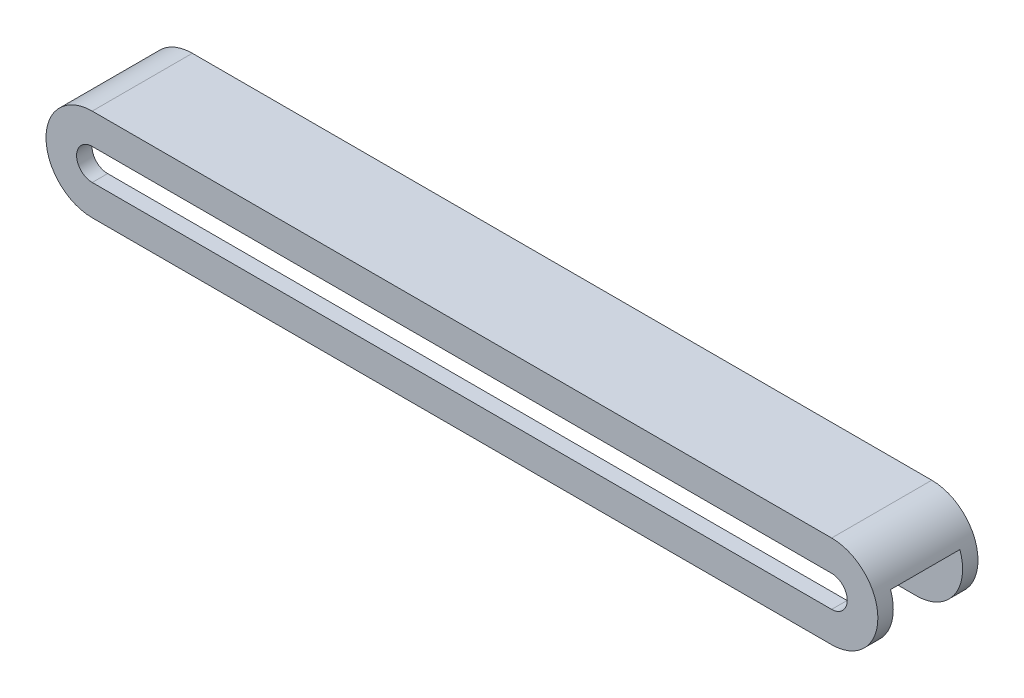
ISO-10303-21;
HEADER;
FILE_DESCRIPTION(('STEP AP214'),'2;1');
FILE_NAME('part.step','',(''),(''),'','','');
FILE_SCHEMA(('AUTOMOTIVE_DESIGN { 1 0 10303 214 1 1 1 1 }'));
ENDSEC;
DATA;
#1=APPLICATION_CONTEXT('core data for automotive mechanical design processes');
#2=APPLICATION_PROTOCOL_DEFINITION('international standard','automotive_design',2000,#1);
#3=PRODUCT_CONTEXT('',#1,'mechanical');
#4=PRODUCT('Part','Part','',(#3));
#5=PRODUCT_RELATED_PRODUCT_CATEGORY('part','',(#4));
#6=PRODUCT_DEFINITION_FORMATION('','',#4);
#7=PRODUCT_DEFINITION_CONTEXT('part definition',#1,'design');
#8=PRODUCT_DEFINITION('design','',#6,#7);
#9=PRODUCT_DEFINITION_SHAPE('','',#8);
#10=(LENGTH_UNIT() NAMED_UNIT(*) SI_UNIT(.MILLI.,.METRE.));
#11=(NAMED_UNIT(*) PLANE_ANGLE_UNIT() SI_UNIT($,.RADIAN.));
#12=(NAMED_UNIT(*) SI_UNIT($,.STERADIAN.) SOLID_ANGLE_UNIT());
#13=UNCERTAINTY_MEASURE_WITH_UNIT(LENGTH_MEASURE(1.E-05),#10,'distance_accuracy_value','');
#14=(GEOMETRIC_REPRESENTATION_CONTEXT(3) GLOBAL_UNCERTAINTY_ASSIGNED_CONTEXT((#13)) GLOBAL_UNIT_ASSIGNED_CONTEXT((#10,
#11,#12)) REPRESENTATION_CONTEXT('',''));
#15=CARTESIAN_POINT('',(0.,0.,0.));
#16=DIRECTION('',(0.,0.,1.));
#17=DIRECTION('',(1.,0.,0.));
#18=AXIS2_PLACEMENT_3D('',#15,#16,#17);
#19=CARTESIAN_POINT('',(0.,-19.05,41.275));
#20=DIRECTION('',(0.,1.,0.));
#21=DIRECTION('',(0.,0.,1.));
#22=AXIS2_PLACEMENT_3D('',#19,#20,#21);
#23=PLANE('',#22);
#24=DIRECTION('',(0.,0.,-1.));
#25=VECTOR('',#24,1.);
#26=CARTESIAN_POINT('',(304.8,-19.05,41.275));
#27=LINE('',#26,#25);
#28=CARTESIAN_POINT('',(304.8,-19.05,6.35));
#29=VERTEX_POINT('',#28);
#30=CARTESIAN_POINT('',(304.8,-19.05,0.));
#31=VERTEX_POINT('',#30);
#32=EDGE_CURVE('E235',#29,#31,#27,.T.);
#33=ORIENTED_EDGE('',*,*,#32,.F.);
#34=DIRECTION('',(1.,0.,0.));
#35=VECTOR('',#34,1.);
#36=CARTESIAN_POINT('',(323.85,-19.05,6.35));
#37=LINE('',#36,#35);
#38=CARTESIAN_POINT('',(0.,-19.05,6.35));
#39=VERTEX_POINT('',#38);
#40=EDGE_CURVE('E266',#39,#29,#37,.T.);
#41=ORIENTED_EDGE('',*,*,#40,.F.);
#42=DIRECTION('',(0.,0.,-1.));
#43=VECTOR('',#42,1.);
#44=CARTESIAN_POINT('',(0.,-19.05,41.275));
#45=LINE('',#44,#43);
#46=CARTESIAN_POINT('',(0.,-19.05,0.));
#47=VERTEX_POINT('',#46);
#48=EDGE_CURVE('E42',#39,#47,#45,.T.);
#49=ORIENTED_EDGE('',*,*,#48,.T.);
#50=DIRECTION('',(1.,0.,0.));
#51=VECTOR('',#50,1.);
#52=CARTESIAN_POINT('',(0.,-19.05,0.));
#53=LINE('',#52,#51);
#54=EDGE_CURVE('E225',#47,#31,#53,.T.);
#55=ORIENTED_EDGE('',*,*,#54,.T.);
#56=EDGE_LOOP('',(#33,#41,#49,#55));
#57=FACE_BOUND('',#56,.T.);
#58=ADVANCED_FACE('F34',(#57),#23,.F.);
#59=CARTESIAN_POINT('',(304.8,0.,41.275));
#60=DIRECTION('',(0.,0.,-1.));
#61=DIRECTION('',(-1.,0.,0.));
#62=AXIS2_PLACEMENT_3D('',#59,#60,#61);
#63=CYLINDRICAL_SURFACE('',#62,19.05);
#64=CARTESIAN_POINT('',(304.8,0.,6.35));
#65=DIRECTION('',(0.,0.,-1.));
#66=DIRECTION('',(-1.,0.,0.));
#67=AXIS2_PLACEMENT_3D('',#64,#65,#66);
#68=CIRCLE('',#67,19.05);
#69=CARTESIAN_POINT('',(322.731112639697,6.43255,6.35));
#70=VERTEX_POINT('',#69);
#71=EDGE_CURVE('E246',#70,#29,#68,.T.);
#72=ORIENTED_EDGE('',*,*,#71,.T.);
#73=ORIENTED_EDGE('',*,*,#32,.T.);
#74=CARTESIAN_POINT('',(304.8,0.,0.));
#75=DIRECTION('',(0.,0.,1.));
#76=DIRECTION('',(1.,0.,0.));
#77=AXIS2_PLACEMENT_3D('',#74,#75,#76);
#78=CIRCLE('',#77,19.05);
#79=CARTESIAN_POINT('',(304.8,19.05,0.));
#80=VERTEX_POINT('',#79);
#81=EDGE_CURVE('E228',#31,#80,#78,.T.);
#82=ORIENTED_EDGE('',*,*,#81,.T.);
#83=DIRECTION('',(0.,0.,-1.));
#84=VECTOR('',#83,1.);
#85=CARTESIAN_POINT('',(304.8,19.05,41.275));
#86=LINE('',#85,#84);
#87=CARTESIAN_POINT('',(304.8,19.05,41.275));
#88=VERTEX_POINT('',#87);
#89=EDGE_CURVE('E233',#88,#80,#86,.T.);
#90=ORIENTED_EDGE('',*,*,#89,.F.);
#91=CARTESIAN_POINT('',(304.8,0.,41.275));
#92=DIRECTION('',(0.,0.,1.));
#93=DIRECTION('',(1.,0.,0.));
#94=AXIS2_PLACEMENT_3D('',#91,#92,#93);
#95=CIRCLE('',#94,19.05);
#96=CARTESIAN_POINT('',(304.8,-19.05,41.275));
#97=VERTEX_POINT('',#96);
#98=EDGE_CURVE('E218',#97,#88,#95,.T.);
#99=ORIENTED_EDGE('',*,*,#98,.F.);
#100=CARTESIAN_POINT('',(304.8,-19.05,34.925));
#101=VERTEX_POINT('',#100);
#102=EDGE_CURVE('E236',#97,#101,#27,.T.);
#103=ORIENTED_EDGE('',*,*,#102,.T.);
#104=CARTESIAN_POINT('',(304.8,0.,34.925));
#105=DIRECTION('',(0.,0.,1.));
#106=DIRECTION('',(1.,0.,0.));
#107=AXIS2_PLACEMENT_3D('',#104,#105,#106);
#108=CIRCLE('',#107,19.05);
#109=CARTESIAN_POINT('',(322.731112639697,6.43254999999998,34.925));
#110=VERTEX_POINT('',#109);
#111=EDGE_CURVE('E157',#101,#110,#108,.T.);
#112=ORIENTED_EDGE('',*,*,#111,.T.);
#113=DIRECTION('',(0.,0.,-1.));
#114=VECTOR('',#113,1.);
#115=CARTESIAN_POINT('',(322.731112639697,6.43255,41.275));
#116=LINE('',#115,#114);
#117=EDGE_CURVE('E172',#70,#110,#116,.F.);
#118=ORIENTED_EDGE('',*,*,#117,.F.);
#119=EDGE_LOOP('',(#72,#73,#82,#90,#99,#103,#112,#118));
#120=FACE_BOUND('',#119,.T.);
#121=ADVANCED_FACE('F242',(#120),#63,.T.);
#122=CARTESIAN_POINT('',(0.,0.,41.275));
#123=DIRECTION('',(0.,0.,-1.));
#124=DIRECTION('',(-1.,0.,0.));
#125=AXIS2_PLACEMENT_3D('',#122,#123,#124);
#126=CYLINDRICAL_SURFACE('',#125,6.43255);
#127=CARTESIAN_POINT('',(0.,0.,6.35));
#128=DIRECTION('',(0.,0.,-1.));
#129=DIRECTION('',(-1.,0.,0.));
#130=AXIS2_PLACEMENT_3D('',#127,#128,#129);
#131=CIRCLE('',#130,6.43255);
#132=CARTESIAN_POINT('',(0.,-6.43255,6.35));
#133=VERTEX_POINT('',#132);
#134=CARTESIAN_POINT('',(0.,6.43254999999998,6.35));
#135=VERTEX_POINT('',#134);
#136=EDGE_CURVE('E281',#133,#135,#131,.T.);
#137=ORIENTED_EDGE('',*,*,#136,.F.);
#138=DIRECTION('',(0.,0.,-1.));
#139=VECTOR('',#138,1.);
#140=CARTESIAN_POINT('',(0.,-6.43255,41.275));
#141=LINE('',#140,#139);
#142=CARTESIAN_POINT('',(0.,-6.43255,0.));
#143=VERTEX_POINT('',#142);
#144=EDGE_CURVE('E207',#133,#143,#141,.T.);
#145=ORIENTED_EDGE('',*,*,#144,.T.);
#146=CARTESIAN_POINT('',(0.,0.,0.));
#147=DIRECTION('',(0.,0.,1.));
#148=DIRECTION('',(1.,0.,0.));
#149=AXIS2_PLACEMENT_3D('',#146,#147,#148);
#150=CIRCLE('',#149,6.43255);
#151=CARTESIAN_POINT('',(0.,6.43255,0.));
#152=VERTEX_POINT('',#151);
#153=EDGE_CURVE('E171',#152,#143,#150,.T.);
#154=ORIENTED_EDGE('',*,*,#153,.F.);
#155=DIRECTION('',(0.,0.,-1.));
#156=VECTOR('',#155,1.);
#157=CARTESIAN_POINT('',(0.,6.43255,41.275));
#158=LINE('',#157,#156);
#159=EDGE_CURVE('E189',#135,#152,#158,.T.);
#160=ORIENTED_EDGE('',*,*,#159,.F.);
#161=EDGE_LOOP('',(#137,#145,#154,#160));
#162=FACE_BOUND('',#161,.T.);
#163=ADVANCED_FACE('F292',(#162),#126,.F.);
#164=CARTESIAN_POINT('',(0.,-6.43255,41.275));
#165=DIRECTION('',(0.,1.,0.));
#166=DIRECTION('',(0.,0.,1.));
#167=AXIS2_PLACEMENT_3D('',#164,#165,#166);
#168=PLANE('',#167);
#169=DIRECTION('',(-1.,0.,0.));
#170=VECTOR('',#169,1.);
#171=CARTESIAN_POINT('',(0.,-6.43255,6.35));
#172=LINE('',#171,#170);
#173=CARTESIAN_POINT('',(304.8,-6.43255,6.35));
#174=VERTEX_POINT('',#173);
#175=EDGE_CURVE('E279',#174,#133,#172,.T.);
#176=ORIENTED_EDGE('',*,*,#175,.F.);
#177=DIRECTION('',(0.,0.,-1.));
#178=VECTOR('',#177,1.);
#179=CARTESIAN_POINT('',(304.8,-6.43255,41.275));
#180=LINE('',#179,#178);
#181=CARTESIAN_POINT('',(304.8,-6.43255,0.));
#182=VERTEX_POINT('',#181);
#183=EDGE_CURVE('E203',#174,#182,#180,.T.);
#184=ORIENTED_EDGE('',*,*,#183,.T.);
#185=DIRECTION('',(1.,0.,0.));
#186=VECTOR('',#185,1.);
#187=CARTESIAN_POINT('',(0.,-6.43255,0.));
#188=LINE('',#187,#186);
#189=EDGE_CURVE('E175',#143,#182,#188,.T.);
#190=ORIENTED_EDGE('',*,*,#189,.F.);
#191=ORIENTED_EDGE('',*,*,#144,.F.);
#192=EDGE_LOOP('',(#176,#184,#190,#191));
#193=FACE_BOUND('',#192,.T.);
#194=ADVANCED_FACE('F300',(#193),#168,.T.);
#195=CARTESIAN_POINT('',(304.8,0.,41.275));
#196=DIRECTION('',(0.,0.,-1.));
#197=DIRECTION('',(-1.,0.,0.));
#198=AXIS2_PLACEMENT_3D('',#195,#196,#197);
#199=CYLINDRICAL_SURFACE('',#198,6.43255);
#200=CARTESIAN_POINT('',(304.8,0.,6.35));
#201=DIRECTION('',(0.,0.,-1.));
#202=DIRECTION('',(-1.,0.,0.));
#203=AXIS2_PLACEMENT_3D('',#200,#201,#202);
#204=CIRCLE('',#203,6.43255);
#205=CARTESIAN_POINT('',(304.8,6.43254999999998,6.35));
#206=VERTEX_POINT('',#205);
#207=EDGE_CURVE('E156',#206,#174,#204,.T.);
#208=ORIENTED_EDGE('',*,*,#207,.F.);
#209=DIRECTION('',(0.,0.,-1.));
#210=VECTOR('',#209,1.);
#211=CARTESIAN_POINT('',(304.8,6.43255,41.275));
#212=LINE('',#211,#210);
#213=CARTESIAN_POINT('',(304.8,6.43255,0.));
#214=VERTEX_POINT('',#213);
#215=EDGE_CURVE('E199',#206,#214,#212,.T.);
#216=ORIENTED_EDGE('',*,*,#215,.T.);
#217=CARTESIAN_POINT('',(304.8,0.,0.));
#218=DIRECTION('',(0.,0.,1.));
#219=DIRECTION('',(1.,0.,0.));
#220=AXIS2_PLACEMENT_3D('',#217,#218,#219);
#221=CIRCLE('',#220,6.43255);
#222=EDGE_CURVE('E193',#182,#214,#221,.T.);
#223=ORIENTED_EDGE('',*,*,#222,.F.);
#224=ORIENTED_EDGE('',*,*,#183,.F.);
#225=EDGE_LOOP('',(#208,#216,#223,#224));
#226=FACE_BOUND('',#225,.T.);
#227=ADVANCED_FACE('F297',(#226),#199,.F.);
#228=CARTESIAN_POINT('',(0.,0.,41.275));
#229=DIRECTION('',(0.,0.,1.));
#230=DIRECTION('',(1.,0.,0.));
#231=AXIS2_PLACEMENT_3D('',#228,#229,#230);
#232=PLANE('',#231);
#233=CARTESIAN_POINT('',(0.,0.,41.275));
#234=DIRECTION('',(0.,0.,1.));
#235=DIRECTION('',(1.,0.,0.));
#236=AXIS2_PLACEMENT_3D('',#233,#234,#235);
#237=CIRCLE('',#236,19.05);
#238=CARTESIAN_POINT('',(0.,19.05,41.275));
#239=VERTEX_POINT('',#238);
#240=CARTESIAN_POINT('',(0.,-19.05,41.275));
#241=VERTEX_POINT('',#240);
#242=EDGE_CURVE('E212',#239,#241,#237,.T.);
#243=ORIENTED_EDGE('',*,*,#242,.T.);
#244=DIRECTION('',(1.,0.,0.));
#245=VECTOR('',#244,1.);
#246=CARTESIAN_POINT('',(0.,-19.05,41.275));
#247=LINE('',#246,#245);
#248=EDGE_CURVE('E215',#241,#97,#247,.T.);
#249=ORIENTED_EDGE('',*,*,#248,.T.);
#250=ORIENTED_EDGE('',*,*,#98,.T.);
#251=DIRECTION('',(-1.,0.,0.));
#252=VECTOR('',#251,1.);
#253=CARTESIAN_POINT('',(0.,19.05,41.275));
#254=LINE('',#253,#252);
#255=EDGE_CURVE('E220',#88,#239,#254,.T.);
#256=ORIENTED_EDGE('',*,*,#255,.T.);
#257=EDGE_LOOP('',(#243,#249,#250,#256));
#258=FACE_BOUND('',#257,.T.);
#259=DIRECTION('',(1.,0.,0.));
#260=VECTOR('',#259,1.);
#261=CARTESIAN_POINT('',(0.,-6.43255,41.275));
#262=LINE('',#261,#260);
#263=CARTESIAN_POINT('',(0.,-6.43255,41.275));
#264=VERTEX_POINT('',#263);
#265=CARTESIAN_POINT('',(304.8,-6.43255,41.275));
#266=VERTEX_POINT('',#265);
#267=EDGE_CURVE('E182',#264,#266,#262,.T.);
#268=ORIENTED_EDGE('',*,*,#267,.F.);
#269=CARTESIAN_POINT('',(0.,0.,41.275));
#270=DIRECTION('',(0.,0.,1.));
#271=DIRECTION('',(1.,0.,0.));
#272=AXIS2_PLACEMENT_3D('',#269,#270,#271);
#273=CIRCLE('',#272,6.43255);
#274=CARTESIAN_POINT('',(0.,6.43255,41.275));
#275=VERTEX_POINT('',#274);
#276=EDGE_CURVE('E180',#275,#264,#273,.T.);
#277=ORIENTED_EDGE('',*,*,#276,.F.);
#278=DIRECTION('',(-1.,0.,0.));
#279=VECTOR('',#278,1.);
#280=CARTESIAN_POINT('',(0.,6.43255,41.275));
#281=LINE('',#280,#279);
#282=CARTESIAN_POINT('',(304.8,6.43255,41.275));
#283=VERTEX_POINT('',#282);
#284=EDGE_CURVE('E188',#283,#275,#281,.T.);
#285=ORIENTED_EDGE('',*,*,#284,.F.);
#286=CARTESIAN_POINT('',(304.8,0.,41.275));
#287=DIRECTION('',(0.,0.,1.));
#288=DIRECTION('',(1.,0.,0.));
#289=AXIS2_PLACEMENT_3D('',#286,#287,#288);
#290=CIRCLE('',#289,6.43255);
#291=EDGE_CURVE('E185',#266,#283,#290,.T.);
#292=ORIENTED_EDGE('',*,*,#291,.F.);
#293=EDGE_LOOP('',(#268,#277,#285,#292));
#294=FACE_BOUND('',#293,.T.);
#295=ADVANCED_FACE('F262',(#258,#294),#232,.T.);
#296=CARTESIAN_POINT('',(0.,0.,0.));
#297=DIRECTION('',(0.,0.,1.));
#298=DIRECTION('',(1.,0.,0.));
#299=AXIS2_PLACEMENT_3D('',#296,#297,#298);
#300=PLANE('',#299);
#301=CARTESIAN_POINT('',(0.,0.,0.));
#302=DIRECTION('',(0.,0.,1.));
#303=DIRECTION('',(1.,0.,0.));
#304=AXIS2_PLACEMENT_3D('',#301,#302,#303);
#305=CIRCLE('',#304,19.05);
#306=CARTESIAN_POINT('',(0.,19.05,0.));
#307=VERTEX_POINT('',#306);
#308=EDGE_CURVE('E211',#307,#47,#305,.T.);
#309=ORIENTED_EDGE('',*,*,#308,.F.);
#310=DIRECTION('',(-1.,0.,0.));
#311=VECTOR('',#310,1.);
#312=CARTESIAN_POINT('',(0.,19.05,0.));
#313=LINE('',#312,#311);
#314=EDGE_CURVE('E216',#80,#307,#313,.T.);
#315=ORIENTED_EDGE('',*,*,#314,.F.);
#316=ORIENTED_EDGE('',*,*,#81,.F.);
#317=ORIENTED_EDGE('',*,*,#54,.F.);
#318=EDGE_LOOP('',(#309,#315,#316,#317));
#319=FACE_BOUND('',#318,.T.);
#320=ORIENTED_EDGE('',*,*,#153,.T.);
#321=ORIENTED_EDGE('',*,*,#189,.T.);
#322=ORIENTED_EDGE('',*,*,#222,.T.);
#323=DIRECTION('',(-1.,0.,0.));
#324=VECTOR('',#323,1.);
#325=CARTESIAN_POINT('',(0.,6.43255,0.));
#326=LINE('',#325,#324);
#327=EDGE_CURVE('E183',#214,#152,#326,.T.);
#328=ORIENTED_EDGE('',*,*,#327,.T.);
#329=EDGE_LOOP('',(#320,#321,#322,#328));
#330=FACE_BOUND('',#329,.T.);
#331=ADVANCED_FACE('F254',(#319,#330),#300,.F.);
#332=CARTESIAN_POINT('',(0.,0.,41.275));
#333=DIRECTION('',(0.,0.,-1.));
#334=DIRECTION('',(-1.,0.,0.));
#335=AXIS2_PLACEMENT_3D('',#332,#333,#334);
#336=CYLINDRICAL_SURFACE('',#335,19.05);
#337=CARTESIAN_POINT('',(0.,0.,34.925));
#338=DIRECTION('',(0.,0.,1.));
#339=DIRECTION('',(1.,0.,0.));
#340=AXIS2_PLACEMENT_3D('',#337,#338,#339);
#341=CIRCLE('',#340,19.05);
#342=CARTESIAN_POINT('',(-17.9311126396969,6.43254999999998,34.925));
#343=VERTEX_POINT('',#342);
#344=CARTESIAN_POINT('',(0.,-19.05,34.925));
#345=VERTEX_POINT('',#344);
#346=EDGE_CURVE('E146',#343,#345,#341,.T.);
#347=ORIENTED_EDGE('',*,*,#346,.T.);
#348=EDGE_CURVE('E11',#241,#345,#45,.T.);
#349=ORIENTED_EDGE('',*,*,#348,.F.);
#350=ORIENTED_EDGE('',*,*,#242,.F.);
#351=DIRECTION('',(0.,0.,-1.));
#352=VECTOR('',#351,1.);
#353=CARTESIAN_POINT('',(0.,19.05,41.275));
#354=LINE('',#353,#352);
#355=EDGE_CURVE('E222',#239,#307,#354,.T.);
#356=ORIENTED_EDGE('',*,*,#355,.T.);
#357=ORIENTED_EDGE('',*,*,#308,.T.);
#358=ORIENTED_EDGE('',*,*,#48,.F.);
#359=CARTESIAN_POINT('',(0.,0.,6.35));
#360=DIRECTION('',(0.,0.,-1.));
#361=DIRECTION('',(-1.,0.,0.));
#362=AXIS2_PLACEMENT_3D('',#359,#360,#361);
#363=CIRCLE('',#362,19.05);
#364=CARTESIAN_POINT('',(-17.9311126396969,6.43254999999998,6.35));
#365=VERTEX_POINT('',#364);
#366=EDGE_CURVE('E170',#39,#365,#363,.T.);
#367=ORIENTED_EDGE('',*,*,#366,.T.);
#368=DIRECTION('',(0.,0.,-1.));
#369=VECTOR('',#368,1.);
#370=CARTESIAN_POINT('',(-17.931112639697,6.43255,41.275));
#371=LINE('',#370,#369);
#372=EDGE_CURVE('E163',#343,#365,#371,.T.);
#373=ORIENTED_EDGE('',*,*,#372,.F.);
#374=EDGE_LOOP('',(#347,#349,#350,#356,#357,#358,#367,#373));
#375=FACE_BOUND('',#374,.T.);
#376=ADVANCED_FACE('F36',(#375),#336,.T.);
#377=ORIENTED_EDGE('',*,*,#348,.T.);
#378=DIRECTION('',(-1.,0.,0.));
#379=VECTOR('',#378,1.);
#380=CARTESIAN_POINT('',(323.85,-19.05,34.925));
#381=LINE('',#380,#379);
#382=EDGE_CURVE('E152',#101,#345,#381,.T.);
#383=ORIENTED_EDGE('',*,*,#382,.F.);
#384=ORIENTED_EDGE('',*,*,#102,.F.);
#385=ORIENTED_EDGE('',*,*,#248,.F.);
#386=EDGE_LOOP('',(#377,#383,#384,#385));
#387=FACE_BOUND('',#386,.T.);
#388=ADVANCED_FACE('F265',(#387),#23,.F.);
#389=CARTESIAN_POINT('',(0.,19.05,41.275));
#390=DIRECTION('',(0.,-1.,0.));
#391=DIRECTION('',(0.,0.,-1.));
#392=AXIS2_PLACEMENT_3D('',#389,#390,#391);
#393=PLANE('',#392);
#394=ORIENTED_EDGE('',*,*,#314,.T.);
#395=ORIENTED_EDGE('',*,*,#355,.F.);
#396=ORIENTED_EDGE('',*,*,#255,.F.);
#397=ORIENTED_EDGE('',*,*,#89,.T.);
#398=EDGE_LOOP('',(#394,#395,#396,#397));
#399=FACE_BOUND('',#398,.T.);
#400=ADVANCED_FACE('F258',(#399),#393,.F.);
#401=CARTESIAN_POINT('',(0.,0.,34.925));
#402=DIRECTION('',(0.,0.,1.));
#403=DIRECTION('',(1.,0.,0.));
#404=AXIS2_PLACEMENT_3D('',#401,#402,#403);
#405=CIRCLE('',#404,6.43255);
#406=CARTESIAN_POINT('',(0.,6.43254999999998,34.925));
#407=VERTEX_POINT('',#406);
#408=CARTESIAN_POINT('',(0.,-6.43255,34.925));
#409=VERTEX_POINT('',#408);
#410=EDGE_CURVE('E275',#407,#409,#405,.T.);
#411=ORIENTED_EDGE('',*,*,#410,.F.);
#412=EDGE_CURVE('E166',#275,#407,#158,.T.);
#413=ORIENTED_EDGE('',*,*,#412,.F.);
#414=ORIENTED_EDGE('',*,*,#276,.T.);
#415=EDGE_CURVE('E208',#264,#409,#141,.T.);
#416=ORIENTED_EDGE('',*,*,#415,.T.);
#417=EDGE_LOOP('',(#411,#413,#414,#416));
#418=FACE_BOUND('',#417,.T.);
#419=ADVANCED_FACE('F311',(#418),#126,.F.);
#420=DIRECTION('',(1.,0.,0.));
#421=VECTOR('',#420,1.);
#422=CARTESIAN_POINT('',(0.,-6.43255,34.925));
#423=LINE('',#422,#421);
#424=CARTESIAN_POINT('',(304.8,-6.43255,34.925));
#425=VERTEX_POINT('',#424);
#426=EDGE_CURVE('E273',#409,#425,#423,.T.);
#427=ORIENTED_EDGE('',*,*,#426,.F.);
#428=ORIENTED_EDGE('',*,*,#415,.F.);
#429=ORIENTED_EDGE('',*,*,#267,.T.);
#430=EDGE_CURVE('E204',#266,#425,#180,.T.);
#431=ORIENTED_EDGE('',*,*,#430,.T.);
#432=EDGE_LOOP('',(#427,#428,#429,#431));
#433=FACE_BOUND('',#432,.T.);
#434=ADVANCED_FACE('F303',(#433),#168,.T.);
#435=CARTESIAN_POINT('',(304.8,0.,34.925));
#436=DIRECTION('',(0.,0.,1.));
#437=DIRECTION('',(1.,0.,0.));
#438=AXIS2_PLACEMENT_3D('',#435,#436,#437);
#439=CIRCLE('',#438,6.43255);
#440=CARTESIAN_POINT('',(304.8,6.43255,34.925));
#441=VERTEX_POINT('',#440);
#442=EDGE_CURVE('E167',#425,#441,#439,.T.);
#443=ORIENTED_EDGE('',*,*,#442,.F.);
#444=ORIENTED_EDGE('',*,*,#430,.F.);
#445=ORIENTED_EDGE('',*,*,#291,.T.);
#446=EDGE_CURVE('E200',#283,#441,#212,.T.);
#447=ORIENTED_EDGE('',*,*,#446,.T.);
#448=EDGE_LOOP('',(#443,#444,#445,#447));
#449=FACE_BOUND('',#448,.T.);
#450=ADVANCED_FACE('F309',(#449),#199,.F.);
#451=CARTESIAN_POINT('',(0.,6.43255,41.275));
#452=DIRECTION('',(0.,-1.,0.));
#453=DIRECTION('',(0.,0.,-1.));
#454=AXIS2_PLACEMENT_3D('',#451,#452,#453);
#455=PLANE('',#454);
#456=ORIENTED_EDGE('',*,*,#412,.T.);
#457=DIRECTION('',(1.,0.,0.));
#458=VECTOR('',#457,1.);
#459=CARTESIAN_POINT('',(323.85,6.43254999999998,34.925));
#460=LINE('',#459,#458);
#461=EDGE_CURVE('E149',#343,#407,#460,.T.);
#462=ORIENTED_EDGE('',*,*,#461,.F.);
#463=ORIENTED_EDGE('',*,*,#372,.T.);
#464=DIRECTION('',(-1.,0.,0.));
#465=VECTOR('',#464,1.);
#466=CARTESIAN_POINT('',(323.85,6.43254999999998,6.35));
#467=LINE('',#466,#465);
#468=EDGE_CURVE('E268',#135,#365,#467,.T.);
#469=ORIENTED_EDGE('',*,*,#468,.F.);
#470=ORIENTED_EDGE('',*,*,#159,.T.);
#471=ORIENTED_EDGE('',*,*,#327,.F.);
#472=ORIENTED_EDGE('',*,*,#215,.F.);
#473=EDGE_CURVE('E49',#70,#206,#467,.T.);
#474=ORIENTED_EDGE('',*,*,#473,.F.);
#475=ORIENTED_EDGE('',*,*,#117,.T.);
#476=EDGE_CURVE('E55',#441,#110,#460,.T.);
#477=ORIENTED_EDGE('',*,*,#476,.F.);
#478=ORIENTED_EDGE('',*,*,#446,.F.);
#479=ORIENTED_EDGE('',*,*,#284,.T.);
#480=EDGE_LOOP('',(#456,#462,#463,#469,#470,#471,#472,#474,#475,#477,#478,#479));
#481=FACE_BOUND('',#480,.T.);
#482=ADVANCED_FACE('F161',(#481),#455,.T.);
#483=CARTESIAN_POINT('',(323.85,350.52111508899,6.35));
#484=DIRECTION('',(0.,0.,-1.));
#485=DIRECTION('',(-1.,0.,0.));
#486=AXIS2_PLACEMENT_3D('',#483,#484,#485);
#487=PLANE('',#486);
#488=ORIENTED_EDGE('',*,*,#366,.F.);
#489=ORIENTED_EDGE('',*,*,#40,.T.);
#490=ORIENTED_EDGE('',*,*,#71,.F.);
#491=ORIENTED_EDGE('',*,*,#473,.T.);
#492=ORIENTED_EDGE('',*,*,#207,.T.);
#493=ORIENTED_EDGE('',*,*,#175,.T.);
#494=ORIENTED_EDGE('',*,*,#136,.T.);
#495=ORIENTED_EDGE('',*,*,#468,.T.);
#496=EDGE_LOOP('',(#488,#489,#490,#491,#492,#493,#494,#495));
#497=FACE_BOUND('',#496,.T.);
#498=ADVANCED_FACE('F285',(#497),#487,.F.);
#499=CARTESIAN_POINT('',(323.85,350.52111508899,34.925));
#500=DIRECTION('',(0.,0.,1.));
#501=DIRECTION('',(1.,0.,0.));
#502=AXIS2_PLACEMENT_3D('',#499,#500,#501);
#503=PLANE('',#502);
#504=ORIENTED_EDGE('',*,*,#461,.T.);
#505=ORIENTED_EDGE('',*,*,#410,.T.);
#506=ORIENTED_EDGE('',*,*,#426,.T.);
#507=ORIENTED_EDGE('',*,*,#442,.T.);
#508=ORIENTED_EDGE('',*,*,#476,.T.);
#509=ORIENTED_EDGE('',*,*,#111,.F.);
#510=ORIENTED_EDGE('',*,*,#382,.T.);
#511=ORIENTED_EDGE('',*,*,#346,.F.);
#512=EDGE_LOOP('',(#504,#505,#506,#507,#508,#509,#510,#511));
#513=FACE_BOUND('',#512,.T.);
#514=ADVANCED_FACE('F148',(#513),#503,.F.);
#515=CLOSED_SHELL('',(#58,#121,#163,#194,#227,#295,#331,#376,#388,#400,#419,#434,#450,#482,#498,#514));
#516=MANIFOLD_SOLID_BREP('B2',#515);
#517=ADVANCED_BREP_SHAPE_REPRESENTATION('',(#18,#516),#14);
#518=SHAPE_DEFINITION_REPRESENTATION(#9,#517);
ENDSEC;
END-ISO-10303-21;
